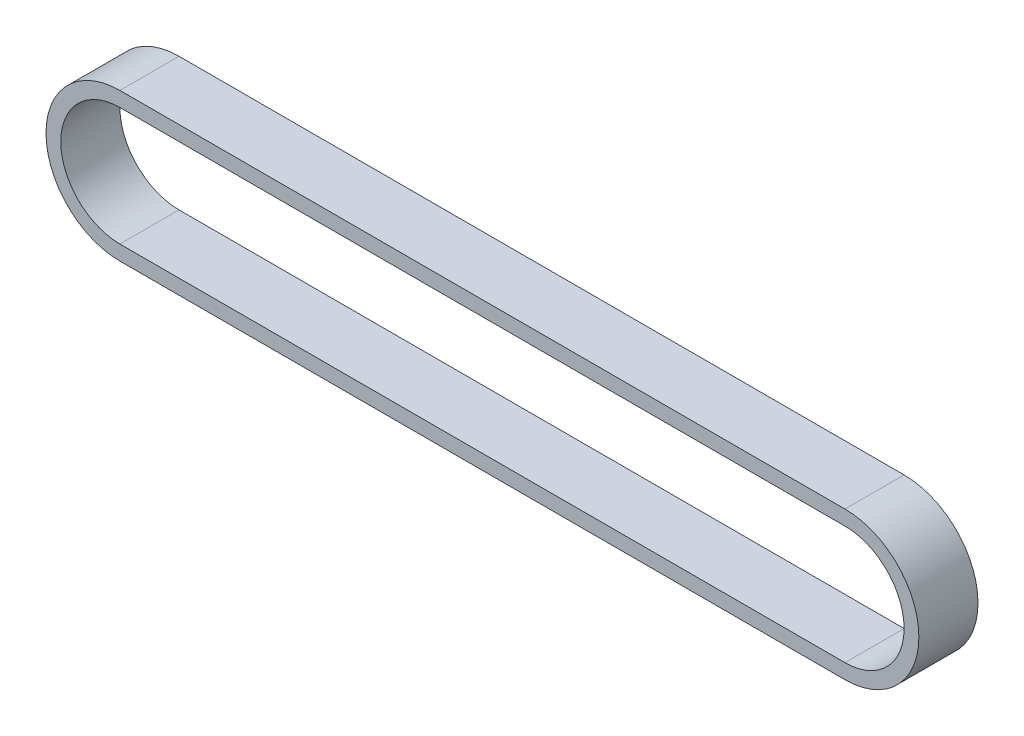
ISO-10303-21;
HEADER;
FILE_DESCRIPTION(('STEP AP214'),'2;1');
FILE_NAME('part.step','',(''),(''),'','','');
FILE_SCHEMA(('AUTOMOTIVE_DESIGN { 1 0 10303 214 1 1 1 1 }'));
ENDSEC;
DATA;
#1=APPLICATION_CONTEXT('core data for automotive mechanical design processes');
#2=APPLICATION_PROTOCOL_DEFINITION('international standard','automotive_design',2000,#1);
#3=PRODUCT_CONTEXT('',#1,'mechanical');
#4=PRODUCT('Part','Part','',(#3));
#5=PRODUCT_RELATED_PRODUCT_CATEGORY('part','',(#4));
#6=PRODUCT_DEFINITION_FORMATION('','',#4);
#7=PRODUCT_DEFINITION_CONTEXT('part definition',#1,'design');
#8=PRODUCT_DEFINITION('design','',#6,#7);
#9=PRODUCT_DEFINITION_SHAPE('','',#8);
#10=(LENGTH_UNIT() NAMED_UNIT(*) SI_UNIT(.MILLI.,.METRE.));
#11=(NAMED_UNIT(*) PLANE_ANGLE_UNIT() SI_UNIT($,.RADIAN.));
#12=(NAMED_UNIT(*) SI_UNIT($,.STERADIAN.) SOLID_ANGLE_UNIT());
#13=UNCERTAINTY_MEASURE_WITH_UNIT(LENGTH_MEASURE(1.E-05),#10,'distance_accuracy_value','');
#14=(GEOMETRIC_REPRESENTATION_CONTEXT(3) GLOBAL_UNCERTAINTY_ASSIGNED_CONTEXT((#13)) GLOBAL_UNIT_ASSIGNED_CONTEXT((#10,
#11,#12)) REPRESENTATION_CONTEXT('',''));
#15=CARTESIAN_POINT('',(0.,0.,0.));
#16=DIRECTION('',(0.,0.,1.));
#17=DIRECTION('',(1.,0.,0.));
#18=AXIS2_PLACEMENT_3D('',#15,#16,#17);
#19=CARTESIAN_POINT('',(-36.7898238758332,-6.5,3.));
#20=DIRECTION('',(0.,0.,1.));
#21=DIRECTION('',(1.,0.,0.));
#22=AXIS2_PLACEMENT_3D('',#19,#20,#21);
#23=PLANE('',#22);
#24=CARTESIAN_POINT('',(-36.7898238758332,-6.5,3.));
#25=DIRECTION('',(0.,0.,1.));
#26=DIRECTION('',(1.,0.,0.));
#27=AXIS2_PLACEMENT_3D('',#24,#25,#26);
#28=CIRCLE('',#27,7.5);
#29=CARTESIAN_POINT('',(-36.7898238758332,1.,3.));
#30=VERTEX_POINT('',#29);
#31=CARTESIAN_POINT('',(-36.7898238758332,-14.,3.));
#32=VERTEX_POINT('',#31);
#33=EDGE_CURVE('E160',#30,#32,#28,.T.);
#34=ORIENTED_EDGE('',*,*,#33,.T.);
#35=DIRECTION('',(1.,0.,0.));
#36=VECTOR('',#35,1.);
#37=CARTESIAN_POINT('',(-36.7898238758332,-14.,3.));
#38=LINE('',#37,#36);
#39=CARTESIAN_POINT('',(36.7898238758332,-14.,3.));
#40=VERTEX_POINT('',#39);
#41=EDGE_CURVE('E163',#32,#40,#38,.T.);
#42=ORIENTED_EDGE('',*,*,#41,.T.);
#43=CARTESIAN_POINT('',(36.7898238758332,-6.5,3.));
#44=DIRECTION('',(0.,0.,1.));
#45=DIRECTION('',(1.,0.,0.));
#46=AXIS2_PLACEMENT_3D('',#43,#44,#45);
#47=CIRCLE('',#46,7.5);
#48=CARTESIAN_POINT('',(36.7898238758332,1.,3.));
#49=VERTEX_POINT('',#48);
#50=EDGE_CURVE('E166',#40,#49,#47,.T.);
#51=ORIENTED_EDGE('',*,*,#50,.T.);
#52=DIRECTION('',(-1.,0.,0.));
#53=VECTOR('',#52,1.);
#54=CARTESIAN_POINT('',(36.7898238758332,1.,3.));
#55=LINE('',#54,#53);
#56=EDGE_CURVE('E168',#49,#30,#55,.T.);
#57=ORIENTED_EDGE('',*,*,#56,.T.);
#58=EDGE_LOOP('',(#34,#42,#51,#57));
#59=FACE_BOUND('',#58,.T.);
#60=DIRECTION('',(1.,0.,0.));
#61=VECTOR('',#60,1.);
#62=CARTESIAN_POINT('',(-36.7898238758332,-12.5,3.));
#63=LINE('',#62,#61);
#64=CARTESIAN_POINT('',(-36.7898238758332,-12.5,3.));
#65=VERTEX_POINT('',#64);
#66=CARTESIAN_POINT('',(36.7898238758332,-12.5,3.));
#67=VERTEX_POINT('',#66);
#68=EDGE_CURVE('E132',#65,#67,#63,.T.);
#69=ORIENTED_EDGE('',*,*,#68,.F.);
#70=CARTESIAN_POINT('',(-36.7898238758332,-6.5,3.));
#71=DIRECTION('',(0.,0.,1.));
#72=DIRECTION('',(1.,0.,0.));
#73=AXIS2_PLACEMENT_3D('',#70,#71,#72);
#74=CIRCLE('',#73,6.);
#75=CARTESIAN_POINT('',(-36.7898238758332,-0.5,3.));
#76=VERTEX_POINT('',#75);
#77=EDGE_CURVE('E124',#76,#65,#74,.T.);
#78=ORIENTED_EDGE('',*,*,#77,.F.);
#79=DIRECTION('',(-1.,0.,0.));
#80=VECTOR('',#79,1.);
#81=CARTESIAN_POINT('',(36.7898238758332,-0.5,3.));
#82=LINE('',#81,#80);
#83=CARTESIAN_POINT('',(36.7898238758332,-0.5,3.));
#84=VERTEX_POINT('',#83);
#85=EDGE_CURVE('E146',#84,#76,#82,.T.);
#86=ORIENTED_EDGE('',*,*,#85,.F.);
#87=CARTESIAN_POINT('',(36.7898238758332,-6.5,3.));
#88=DIRECTION('',(0.,0.,1.));
#89=DIRECTION('',(1.,0.,0.));
#90=AXIS2_PLACEMENT_3D('',#87,#88,#89);
#91=CIRCLE('',#90,6.);
#92=EDGE_CURVE('E144',#67,#84,#91,.T.);
#93=ORIENTED_EDGE('',*,*,#92,.F.);
#94=EDGE_LOOP('',(#69,#78,#86,#93));
#95=FACE_BOUND('',#94,.T.);
#96=ADVANCED_FACE('F59',(#59,#95),#23,.T.);
#97=CARTESIAN_POINT('',(-36.7898238758332,-6.5,-3.));
#98=DIRECTION('',(0.,0.,1.));
#99=DIRECTION('',(1.,0.,0.));
#100=AXIS2_PLACEMENT_3D('',#97,#98,#99);
#101=PLANE('',#100);
#102=CARTESIAN_POINT('',(-36.7898238758332,-6.5,-3.));
#103=DIRECTION('',(0.,0.,1.));
#104=DIRECTION('',(1.,0.,0.));
#105=AXIS2_PLACEMENT_3D('',#102,#103,#104);
#106=CIRCLE('',#105,7.5);
#107=CARTESIAN_POINT('',(-36.7898238758332,1.,-3.));
#108=VERTEX_POINT('',#107);
#109=CARTESIAN_POINT('',(-36.7898238758332,-14.,-3.));
#110=VERTEX_POINT('',#109);
#111=EDGE_CURVE('E140',#108,#110,#106,.T.);
#112=ORIENTED_EDGE('',*,*,#111,.F.);
#113=DIRECTION('',(-1.,0.,0.));
#114=VECTOR('',#113,1.);
#115=CARTESIAN_POINT('',(36.7898238758332,1.,-3.));
#116=LINE('',#115,#114);
#117=CARTESIAN_POINT('',(36.7898238758332,1.,-3.));
#118=VERTEX_POINT('',#117);
#119=EDGE_CURVE('E164',#118,#108,#116,.T.);
#120=ORIENTED_EDGE('',*,*,#119,.F.);
#121=CARTESIAN_POINT('',(36.7898238758332,-6.5,-3.));
#122=DIRECTION('',(0.,0.,1.));
#123=DIRECTION('',(1.,0.,0.));
#124=AXIS2_PLACEMENT_3D('',#121,#122,#123);
#125=CIRCLE('',#124,7.5);
#126=CARTESIAN_POINT('',(36.7898238758332,-14.,-3.));
#127=VERTEX_POINT('',#126);
#128=EDGE_CURVE('E175',#127,#118,#125,.T.);
#129=ORIENTED_EDGE('',*,*,#128,.F.);
#130=DIRECTION('',(1.,0.,0.));
#131=VECTOR('',#130,1.);
#132=CARTESIAN_POINT('',(-36.7898238758332,-14.,-3.));
#133=LINE('',#132,#131);
#134=EDGE_CURVE('E173',#110,#127,#133,.T.);
#135=ORIENTED_EDGE('',*,*,#134,.F.);
#136=EDGE_LOOP('',(#112,#120,#129,#135));
#137=FACE_BOUND('',#136,.T.);
#138=CARTESIAN_POINT('',(-36.7898238758332,-6.5,-3.));
#139=DIRECTION('',(0.,0.,1.));
#140=DIRECTION('',(1.,0.,0.));
#141=AXIS2_PLACEMENT_3D('',#138,#139,#140);
#142=CIRCLE('',#141,6.);
#143=CARTESIAN_POINT('',(-36.7898238758332,-0.5,-3.));
#144=VERTEX_POINT('',#143);
#145=CARTESIAN_POINT('',(-36.7898238758332,-12.5,-3.));
#146=VERTEX_POINT('',#145);
#147=EDGE_CURVE('E82',#144,#146,#142,.T.);
#148=ORIENTED_EDGE('',*,*,#147,.T.);
#149=DIRECTION('',(1.,0.,0.));
#150=VECTOR('',#149,1.);
#151=CARTESIAN_POINT('',(-36.7898238758332,-12.5,-3.));
#152=LINE('',#151,#150);
#153=CARTESIAN_POINT('',(36.7898238758332,-12.5,-3.));
#154=VERTEX_POINT('',#153);
#155=EDGE_CURVE('E139',#146,#154,#152,.T.);
#156=ORIENTED_EDGE('',*,*,#155,.T.);
#157=CARTESIAN_POINT('',(36.7898238758332,-6.5,-3.));
#158=DIRECTION('',(0.,0.,1.));
#159=DIRECTION('',(1.,0.,0.));
#160=AXIS2_PLACEMENT_3D('',#157,#158,#159);
#161=CIRCLE('',#160,6.);
#162=CARTESIAN_POINT('',(36.7898238758332,-0.5,-3.));
#163=VERTEX_POINT('',#162);
#164=EDGE_CURVE('E152',#154,#163,#161,.T.);
#165=ORIENTED_EDGE('',*,*,#164,.T.);
#166=DIRECTION('',(-1.,0.,0.));
#167=VECTOR('',#166,1.);
#168=CARTESIAN_POINT('',(36.7898238758332,-0.5,-3.));
#169=LINE('',#168,#167);
#170=EDGE_CURVE('E133',#163,#144,#169,.T.);
#171=ORIENTED_EDGE('',*,*,#170,.T.);
#172=EDGE_LOOP('',(#148,#156,#165,#171));
#173=FACE_BOUND('',#172,.T.);
#174=ADVANCED_FACE('F193',(#137,#173),#101,.F.);
#175=CARTESIAN_POINT('',(-36.7898238758332,-6.5,3.));
#176=DIRECTION('',(0.,0.,-1.));
#177=DIRECTION('',(-1.,0.,0.));
#178=AXIS2_PLACEMENT_3D('',#175,#176,#177);
#179=CYLINDRICAL_SURFACE('',#178,7.5);
#180=ORIENTED_EDGE('',*,*,#111,.T.);
#181=DIRECTION('',(0.,0.,-1.));
#182=VECTOR('',#181,1.);
#183=CARTESIAN_POINT('',(-36.7898238758332,-14.,3.));
#184=LINE('',#183,#182);
#185=EDGE_CURVE('E12',#32,#110,#184,.T.);
#186=ORIENTED_EDGE('',*,*,#185,.F.);
#187=ORIENTED_EDGE('',*,*,#33,.F.);
#188=DIRECTION('',(0.,0.,-1.));
#189=VECTOR('',#188,1.);
#190=CARTESIAN_POINT('',(-36.7898238758332,1.,3.));
#191=LINE('',#190,#189);
#192=EDGE_CURVE('E170',#30,#108,#191,.T.);
#193=ORIENTED_EDGE('',*,*,#192,.T.);
#194=EDGE_LOOP('',(#180,#186,#187,#193));
#195=FACE_BOUND('',#194,.T.);
#196=ADVANCED_FACE('F61',(#195),#179,.T.);
#197=CARTESIAN_POINT('',(-36.7898238758332,-14.,3.));
#198=DIRECTION('',(0.,1.,0.));
#199=DIRECTION('',(0.,0.,1.));
#200=AXIS2_PLACEMENT_3D('',#197,#198,#199);
#201=PLANE('',#200);
#202=ORIENTED_EDGE('',*,*,#134,.T.);
#203=DIRECTION('',(0.,0.,-1.));
#204=VECTOR('',#203,1.);
#205=CARTESIAN_POINT('',(36.7898238758332,-14.,3.));
#206=LINE('',#205,#204);
#207=EDGE_CURVE('E67',#40,#127,#206,.T.);
#208=ORIENTED_EDGE('',*,*,#207,.F.);
#209=ORIENTED_EDGE('',*,*,#41,.F.);
#210=ORIENTED_EDGE('',*,*,#185,.T.);
#211=EDGE_LOOP('',(#202,#208,#209,#210));
#212=FACE_BOUND('',#211,.T.);
#213=ADVANCED_FACE('F203',(#212),#201,.F.);
#214=CARTESIAN_POINT('',(36.7898238758332,-6.5,3.));
#215=DIRECTION('',(0.,0.,-1.));
#216=DIRECTION('',(-1.,0.,0.));
#217=AXIS2_PLACEMENT_3D('',#214,#215,#216);
#218=CYLINDRICAL_SURFACE('',#217,7.5);
#219=ORIENTED_EDGE('',*,*,#128,.T.);
#220=DIRECTION('',(0.,0.,-1.));
#221=VECTOR('',#220,1.);
#222=CARTESIAN_POINT('',(36.7898238758332,1.,3.));
#223=LINE('',#222,#221);
#224=EDGE_CURVE('E180',#49,#118,#223,.T.);
#225=ORIENTED_EDGE('',*,*,#224,.F.);
#226=ORIENTED_EDGE('',*,*,#50,.F.);
#227=ORIENTED_EDGE('',*,*,#207,.T.);
#228=EDGE_LOOP('',(#219,#225,#226,#227));
#229=FACE_BOUND('',#228,.T.);
#230=ADVANCED_FACE('F187',(#229),#218,.T.);
#231=CARTESIAN_POINT('',(36.7898238758332,1.,3.));
#232=DIRECTION('',(0.,-1.,0.));
#233=DIRECTION('',(1.,0.,0.));
#234=AXIS2_PLACEMENT_3D('',#231,#232,#233);
#235=PLANE('',#234);
#236=ORIENTED_EDGE('',*,*,#119,.T.);
#237=ORIENTED_EDGE('',*,*,#192,.F.);
#238=ORIENTED_EDGE('',*,*,#56,.F.);
#239=ORIENTED_EDGE('',*,*,#224,.T.);
#240=EDGE_LOOP('',(#236,#237,#238,#239));
#241=FACE_BOUND('',#240,.T.);
#242=ADVANCED_FACE('F197',(#241),#235,.F.);
#243=CARTESIAN_POINT('',(-36.7898238758332,-6.5,3.));
#244=DIRECTION('',(0.,0.,-1.));
#245=DIRECTION('',(-1.,0.,0.));
#246=AXIS2_PLACEMENT_3D('',#243,#244,#245);
#247=CYLINDRICAL_SURFACE('',#246,6.);
#248=ORIENTED_EDGE('',*,*,#147,.F.);
#249=DIRECTION('',(0.,0.,-1.));
#250=VECTOR('',#249,1.);
#251=CARTESIAN_POINT('',(-36.7898238758332,-0.5,3.));
#252=LINE('',#251,#250);
#253=EDGE_CURVE('E128',#76,#144,#252,.T.);
#254=ORIENTED_EDGE('',*,*,#253,.F.);
#255=ORIENTED_EDGE('',*,*,#77,.T.);
#256=DIRECTION('',(0.,0.,-1.));
#257=VECTOR('',#256,1.);
#258=CARTESIAN_POINT('',(-36.7898238758332,-12.5,3.));
#259=LINE('',#258,#257);
#260=EDGE_CURVE('E127',#65,#146,#259,.T.);
#261=ORIENTED_EDGE('',*,*,#260,.T.);
#262=EDGE_LOOP('',(#248,#254,#255,#261));
#263=FACE_BOUND('',#262,.T.);
#264=ADVANCED_FACE('F126',(#263),#247,.F.);
#265=CARTESIAN_POINT('',(-36.7898238758332,-12.5,3.));
#266=DIRECTION('',(0.,1.,0.));
#267=DIRECTION('',(0.,0.,1.));
#268=AXIS2_PLACEMENT_3D('',#265,#266,#267);
#269=PLANE('',#268);
#270=ORIENTED_EDGE('',*,*,#155,.F.);
#271=ORIENTED_EDGE('',*,*,#260,.F.);
#272=ORIENTED_EDGE('',*,*,#68,.T.);
#273=DIRECTION('',(0.,0.,-1.));
#274=VECTOR('',#273,1.);
#275=CARTESIAN_POINT('',(36.7898238758332,-12.5,3.));
#276=LINE('',#275,#274);
#277=EDGE_CURVE('E141',#67,#154,#276,.T.);
#278=ORIENTED_EDGE('',*,*,#277,.T.);
#279=EDGE_LOOP('',(#270,#271,#272,#278));
#280=FACE_BOUND('',#279,.T.);
#281=ADVANCED_FACE('F136',(#280),#269,.T.);
#282=CARTESIAN_POINT('',(36.7898238758332,-6.5,3.));
#283=DIRECTION('',(0.,0.,-1.));
#284=DIRECTION('',(-1.,0.,0.));
#285=AXIS2_PLACEMENT_3D('',#282,#283,#284);
#286=CYLINDRICAL_SURFACE('',#285,6.);
#287=ORIENTED_EDGE('',*,*,#164,.F.);
#288=ORIENTED_EDGE('',*,*,#277,.F.);
#289=ORIENTED_EDGE('',*,*,#92,.T.);
#290=DIRECTION('',(0.,0.,-1.));
#291=VECTOR('',#290,1.);
#292=CARTESIAN_POINT('',(36.7898238758332,-0.5,3.));
#293=LINE('',#292,#291);
#294=EDGE_CURVE('E74',#84,#163,#293,.T.);
#295=ORIENTED_EDGE('',*,*,#294,.T.);
#296=EDGE_LOOP('',(#287,#288,#289,#295));
#297=FACE_BOUND('',#296,.T.);
#298=ADVANCED_FACE('F226',(#297),#286,.F.);
#299=CARTESIAN_POINT('',(36.7898238758332,-0.5,3.));
#300=DIRECTION('',(0.,-1.,0.));
#301=DIRECTION('',(1.,0.,0.));
#302=AXIS2_PLACEMENT_3D('',#299,#300,#301);
#303=PLANE('',#302);
#304=ORIENTED_EDGE('',*,*,#170,.F.);
#305=ORIENTED_EDGE('',*,*,#294,.F.);
#306=ORIENTED_EDGE('',*,*,#85,.T.);
#307=ORIENTED_EDGE('',*,*,#253,.T.);
#308=EDGE_LOOP('',(#304,#305,#306,#307));
#309=FACE_BOUND('',#308,.T.);
#310=ADVANCED_FACE('F230',(#309),#303,.T.);
#311=CLOSED_SHELL('',(#96,#174,#196,#213,#230,#242,#264,#281,#298,#310));
#312=MANIFOLD_SOLID_BREP('B2',#311);
#313=ADVANCED_BREP_SHAPE_REPRESENTATION('',(#18,#312),#14);
#314=SHAPE_DEFINITION_REPRESENTATION(#9,#313);
ENDSEC;
END-ISO-10303-21;
